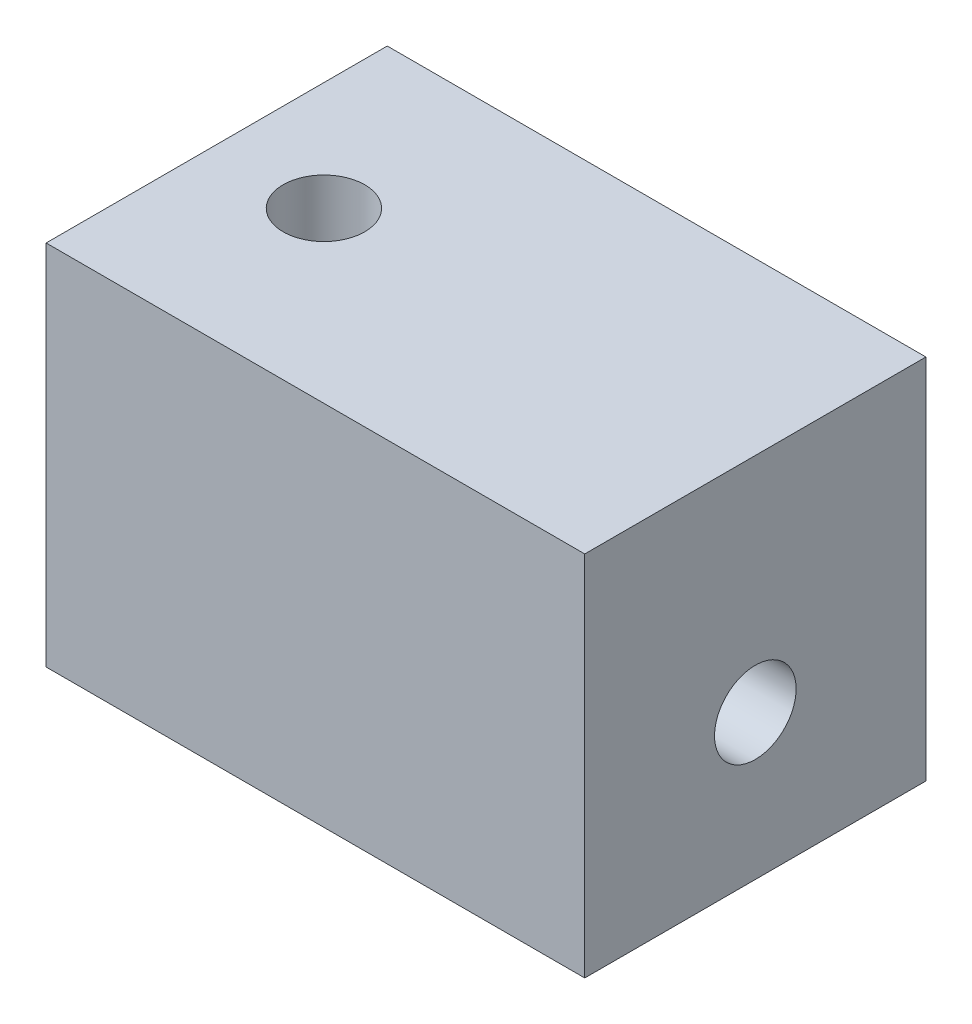
ISO-10303-21;
HEADER;
FILE_DESCRIPTION(('STEP AP214'),'2;1');
FILE_NAME('part.step','',(''),(''),'','','');
FILE_SCHEMA(('AUTOMOTIVE_DESIGN { 1 0 10303 214 1 1 1 1 }'));
ENDSEC;
DATA;
#1=APPLICATION_CONTEXT('core data for automotive mechanical design processes');
#2=APPLICATION_PROTOCOL_DEFINITION('international standard','automotive_design',2000,#1);
#3=PRODUCT_CONTEXT('',#1,'mechanical');
#4=PRODUCT('Part','Part','',(#3));
#5=PRODUCT_RELATED_PRODUCT_CATEGORY('part','',(#4));
#6=PRODUCT_DEFINITION_FORMATION('','',#4);
#7=PRODUCT_DEFINITION_CONTEXT('part definition',#1,'design');
#8=PRODUCT_DEFINITION('design','',#6,#7);
#9=PRODUCT_DEFINITION_SHAPE('','',#8);
#10=(LENGTH_UNIT() NAMED_UNIT(*) SI_UNIT(.MILLI.,.METRE.));
#11=(NAMED_UNIT(*) PLANE_ANGLE_UNIT() SI_UNIT($,.RADIAN.));
#12=(NAMED_UNIT(*) SI_UNIT($,.STERADIAN.) SOLID_ANGLE_UNIT());
#13=UNCERTAINTY_MEASURE_WITH_UNIT(LENGTH_MEASURE(1.E-05),#10,'distance_accuracy_value','');
#14=(GEOMETRIC_REPRESENTATION_CONTEXT(3) GLOBAL_UNCERTAINTY_ASSIGNED_CONTEXT((#13)) GLOBAL_UNIT_ASSIGNED_CONTEXT((#10,
#11,#12)) REPRESENTATION_CONTEXT('',''));
#15=CARTESIAN_POINT('',(0.,0.,0.));
#16=DIRECTION('',(0.,0.,1.));
#17=DIRECTION('',(1.,0.,0.));
#18=AXIS2_PLACEMENT_3D('',#15,#16,#17);
#19=CARTESIAN_POINT('',(0.,0.,12.9));
#20=DIRECTION('',(0.,0.,-1.));
#21=DIRECTION('',(-1.,0.,0.));
#22=AXIS2_PLACEMENT_3D('',#19,#20,#21);
#23=PLANE('',#22);
#24=DIRECTION('',(0.,-1.,0.));
#25=VECTOR('',#24,1.);
#26=CARTESIAN_POINT('',(-12.7,-12.7,12.9));
#27=LINE('',#26,#25);
#28=CARTESIAN_POINT('',(-12.7,-12.7,12.9));
#29=VERTEX_POINT('',#28);
#30=CARTESIAN_POINT('',(-12.7,-16.5,12.9));
#31=VERTEX_POINT('',#30);
#32=EDGE_CURVE('E241',#29,#31,#27,.T.);
#33=ORIENTED_EDGE('',*,*,#32,.F.);
#34=DIRECTION('',(1.,0.,0.));
#35=VECTOR('',#34,1.);
#36=CARTESIAN_POINT('',(-30.,-12.7,12.9));
#37=LINE('',#36,#35);
#38=CARTESIAN_POINT('',(-27.,-12.7,12.9));
#39=VERTEX_POINT('',#38);
#40=EDGE_CURVE('E56',#39,#29,#37,.T.);
#41=ORIENTED_EDGE('',*,*,#40,.F.);
#42=DIRECTION('',(0.,-1.,0.));
#43=VECTOR('',#42,1.);
#44=CARTESIAN_POINT('',(-27.,0.,12.9));
#45=LINE('',#44,#43);
#46=CARTESIAN_POINT('',(-27.,0.,12.9));
#47=VERTEX_POINT('',#46);
#48=EDGE_CURVE('E278',#47,#39,#45,.T.);
#49=ORIENTED_EDGE('',*,*,#48,.F.);
#50=DIRECTION('',(1.,0.,0.));
#51=VECTOR('',#50,1.);
#52=CARTESIAN_POINT('',(0.,0.,12.9));
#53=LINE('',#52,#51);
#54=CARTESIAN_POINT('',(0.,0.,12.9));
#55=VERTEX_POINT('',#54);
#56=EDGE_CURVE('E313',#47,#55,#53,.T.);
#57=ORIENTED_EDGE('',*,*,#56,.T.);
#58=DIRECTION('',(0.,-1.,0.));
#59=VECTOR('',#58,1.);
#60=CARTESIAN_POINT('',(0.,0.,12.9));
#61=LINE('',#60,#59);
#62=CARTESIAN_POINT('',(0.,-16.5,12.9));
#63=VERTEX_POINT('',#62);
#64=EDGE_CURVE('E310',#55,#63,#61,.T.);
#65=ORIENTED_EDGE('',*,*,#64,.T.);
#66=DIRECTION('',(1.,0.,0.));
#67=VECTOR('',#66,1.);
#68=CARTESIAN_POINT('',(0.,-16.5,12.9));
#69=LINE('',#68,#67);
#70=EDGE_CURVE('E63',#31,#63,#69,.T.);
#71=ORIENTED_EDGE('',*,*,#70,.F.);
#72=EDGE_LOOP('',(#33,#41,#49,#57,#65,#71));
#73=FACE_BOUND('',#72,.T.);
#74=ADVANCED_FACE('F40',(#73),#23,.T.);
#75=CARTESIAN_POINT('',(-14.,-16.5,16.9));
#76=DIRECTION('',(0.,1.,0.));
#77=DIRECTION('',(-1.,0.,0.));
#78=AXIS2_PLACEMENT_3D('',#75,#76,#77);
#79=PLANE('',#78);
#80=DIRECTION('',(0.,0.,-1.));
#81=VECTOR('',#80,1.);
#82=CARTESIAN_POINT('',(-12.7,-16.5,12.9));
#83=LINE('',#82,#81);
#84=CARTESIAN_POINT('',(-12.7,-16.5,-4.));
#85=VERTEX_POINT('',#84);
#86=EDGE_CURVE('E245',#31,#85,#83,.T.);
#87=ORIENTED_EDGE('',*,*,#86,.F.);
#88=ORIENTED_EDGE('',*,*,#70,.T.);
#89=DIRECTION('',(0.,0.,1.));
#90=VECTOR('',#89,1.);
#91=CARTESIAN_POINT('',(0.,-16.5,12.9));
#92=LINE('',#91,#90);
#93=CARTESIAN_POINT('',(0.,-16.5,-4.));
#94=VERTEX_POINT('',#93);
#95=EDGE_CURVE('E161',#94,#63,#92,.T.);
#96=ORIENTED_EDGE('',*,*,#95,.F.);
#97=DIRECTION('',(-1.,0.,0.));
#98=VECTOR('',#97,1.);
#99=CARTESIAN_POINT('',(0.,-16.5,-4.));
#100=LINE('',#99,#98);
#101=CARTESIAN_POINT('',(6.,-16.5,-4.));
#102=VERTEX_POINT('',#101);
#103=EDGE_CURVE('E157',#102,#94,#100,.T.);
#104=ORIENTED_EDGE('',*,*,#103,.F.);
#105=DIRECTION('',(0.,0.,1.));
#106=VECTOR('',#105,1.);
#107=CARTESIAN_POINT('',(6.,-16.5,16.9));
#108=LINE('',#107,#106);
#109=CARTESIAN_POINT('',(6.,-16.5,16.9));
#110=VERTEX_POINT('',#109);
#111=EDGE_CURVE('E143',#102,#110,#108,.T.);
#112=ORIENTED_EDGE('',*,*,#111,.T.);
#113=DIRECTION('',(1.,0.,0.));
#114=VECTOR('',#113,1.);
#115=CARTESIAN_POINT('',(-14.,-16.5,16.9));
#116=LINE('',#115,#114);
#117=CARTESIAN_POINT('',(-27.,-16.5,16.9));
#118=VERTEX_POINT('',#117);
#119=EDGE_CURVE('E153',#118,#110,#116,.T.);
#120=ORIENTED_EDGE('',*,*,#119,.F.);
#121=DIRECTION('',(0.,0.,1.));
#122=VECTOR('',#121,1.);
#123=CARTESIAN_POINT('',(-27.,-16.5,16.9));
#124=LINE('',#123,#122);
#125=CARTESIAN_POINT('',(-27.,-16.5,-4.));
#126=VERTEX_POINT('',#125);
#127=EDGE_CURVE('E252',#126,#118,#124,.T.);
#128=ORIENTED_EDGE('',*,*,#127,.F.);
#129=DIRECTION('',(1.,0.,0.));
#130=VECTOR('',#129,1.);
#131=CARTESIAN_POINT('',(0.,-16.5,-4.));
#132=LINE('',#131,#130);
#133=EDGE_CURVE('E189',#126,#85,#132,.T.);
#134=ORIENTED_EDGE('',*,*,#133,.T.);
#135=EDGE_LOOP('',(#87,#88,#96,#104,#112,#120,#128,#134));
#136=FACE_BOUND('',#135,.T.);
#137=CARTESIAN_POINT('',(-20.33,-16.5,6.45));
#138=DIRECTION('',(0.,1.,0.));
#139=DIRECTION('',(-1.,0.,0.));
#140=AXIS2_PLACEMENT_3D('',#137,#138,#139);
#141=CIRCLE('',#140,2.5);
#142=CARTESIAN_POINT('',(-22.83,-16.5,6.45));
#143=VERTEX_POINT('',#142);
#144=EDGE_CURVE('E154',#143,#143,#141,.F.);
#145=ORIENTED_EDGE('',*,*,#144,.F.);
#146=EDGE_LOOP('',(#145));
#147=FACE_BOUND('',#146,.T.);
#148=ADVANCED_FACE('F158',(#136,#147),#79,.F.);
#149=CARTESIAN_POINT('',(0.,0.,12.9));
#150=DIRECTION('',(1.,0.,0.));
#151=DIRECTION('',(0.,1.,0.));
#152=AXIS2_PLACEMENT_3D('',#149,#150,#151);
#153=PLANE('',#152);
#154=CARTESIAN_POINT('',(0.,-7.63,6.45));
#155=DIRECTION('',(-1.,0.,0.));
#156=DIRECTION('',(0.,-1.,0.));
#157=AXIS2_PLACEMENT_3D('',#154,#155,#156);
#158=CIRCLE('',#157,2.5);
#159=CARTESIAN_POINT('',(0.,-10.13,6.45));
#160=VERTEX_POINT('',#159);
#161=EDGE_CURVE('E293',#160,#160,#158,.T.);
#162=ORIENTED_EDGE('',*,*,#161,.F.);
#163=EDGE_LOOP('',(#162));
#164=FACE_BOUND('',#163,.T.);
#165=DIRECTION('',(0.,-1.,0.));
#166=VECTOR('',#165,1.);
#167=CARTESIAN_POINT('',(0.,0.,0.));
#168=LINE('',#167,#166);
#169=CARTESIAN_POINT('',(0.,0.,0.));
#170=VERTEX_POINT('',#169);
#171=CARTESIAN_POINT('',(0.,-3.5,0.));
#172=VERTEX_POINT('',#171);
#173=EDGE_CURVE('E306',#170,#172,#168,.T.);
#174=ORIENTED_EDGE('',*,*,#173,.T.);
#175=DIRECTION('',(0.,0.,1.));
#176=VECTOR('',#175,1.);
#177=CARTESIAN_POINT('',(0.,-3.5,-4.));
#178=LINE('',#177,#176);
#179=CARTESIAN_POINT('',(0.,-3.5,-4.));
#180=VERTEX_POINT('',#179);
#181=EDGE_CURVE('E231',#180,#172,#178,.T.);
#182=ORIENTED_EDGE('',*,*,#181,.F.);
#183=DIRECTION('',(0.,1.,0.));
#184=VECTOR('',#183,1.);
#185=CARTESIAN_POINT('',(0.,0.,-4.));
#186=LINE('',#185,#184);
#187=EDGE_CURVE('E165',#94,#180,#186,.T.);
#188=ORIENTED_EDGE('',*,*,#187,.F.);
#189=ORIENTED_EDGE('',*,*,#95,.T.);
#190=ORIENTED_EDGE('',*,*,#64,.F.);
#191=DIRECTION('',(0.,0.,-1.));
#192=VECTOR('',#191,1.);
#193=CARTESIAN_POINT('',(0.,0.,12.9));
#194=LINE('',#193,#192);
#195=EDGE_CURVE('E49',#55,#170,#194,.T.);
#196=ORIENTED_EDGE('',*,*,#195,.T.);
#197=EDGE_LOOP('',(#174,#182,#188,#189,#190,#196));
#198=FACE_BOUND('',#197,.T.);
#199=ADVANCED_FACE('F42',(#164,#198),#153,.F.);
#200=CARTESIAN_POINT('',(6.,6.,12.9));
#201=DIRECTION('',(-1.,0.,0.));
#202=DIRECTION('',(0.,-1.,0.));
#203=AXIS2_PLACEMENT_3D('',#200,#201,#202);
#204=PLANE('',#203);
#205=CARTESIAN_POINT('',(6.,-7.63,6.45));
#206=DIRECTION('',(-1.,0.,0.));
#207=DIRECTION('',(0.,-1.,0.));
#208=AXIS2_PLACEMENT_3D('',#205,#206,#207);
#209=CIRCLE('',#208,2.5);
#210=CARTESIAN_POINT('',(6.,-10.13,6.45));
#211=VERTEX_POINT('',#210);
#212=EDGE_CURVE('E294',#211,#211,#209,.T.);
#213=ORIENTED_EDGE('',*,*,#212,.T.);
#214=EDGE_LOOP('',(#213));
#215=FACE_BOUND('',#214,.T.);
#216=DIRECTION('',(0.,1.,0.));
#217=VECTOR('',#216,1.);
#218=CARTESIAN_POINT('',(6.,6.,16.9));
#219=LINE('',#218,#217);
#220=CARTESIAN_POINT('',(6.,6.,16.9));
#221=VERTEX_POINT('',#220);
#222=EDGE_CURVE('E149',#110,#221,#219,.T.);
#223=ORIENTED_EDGE('',*,*,#222,.F.);
#224=ORIENTED_EDGE('',*,*,#111,.F.);
#225=DIRECTION('',(0.,-1.,0.));
#226=VECTOR('',#225,1.);
#227=CARTESIAN_POINT('',(6.,0.,-4.));
#228=LINE('',#227,#226);
#229=CARTESIAN_POINT('',(6.,6.,-4.));
#230=VERTEX_POINT('',#229);
#231=EDGE_CURVE('E148',#230,#102,#228,.T.);
#232=ORIENTED_EDGE('',*,*,#231,.F.);
#233=DIRECTION('',(0.,0.,-1.));
#234=VECTOR('',#233,1.);
#235=CARTESIAN_POINT('',(6.,6.,12.9));
#236=LINE('',#235,#234);
#237=EDGE_CURVE('E11',#221,#230,#236,.T.);
#238=ORIENTED_EDGE('',*,*,#237,.F.);
#239=EDGE_LOOP('',(#223,#224,#232,#238));
#240=FACE_BOUND('',#239,.T.);
#241=ADVANCED_FACE('F145',(#215,#240),#204,.F.);
#242=CARTESIAN_POINT('',(-30.,6.,12.9));
#243=DIRECTION('',(0.,-1.,0.));
#244=DIRECTION('',(0.,0.,-1.));
#245=AXIS2_PLACEMENT_3D('',#242,#243,#244);
#246=PLANE('',#245);
#247=CARTESIAN_POINT('',(-20.33,6.,6.55));
#248=DIRECTION('',(0.,-1.,0.));
#249=DIRECTION('',(0.,0.,-1.));
#250=AXIS2_PLACEMENT_3D('',#247,#248,#249);
#251=CIRCLE('',#250,2.5);
#252=CARTESIAN_POINT('',(-20.33,6.,4.05));
#253=VERTEX_POINT('',#252);
#254=EDGE_CURVE('E302',#253,#253,#251,.T.);
#255=ORIENTED_EDGE('',*,*,#254,.T.);
#256=EDGE_LOOP('',(#255));
#257=FACE_BOUND('',#256,.T.);
#258=ORIENTED_EDGE('',*,*,#237,.T.);
#259=DIRECTION('',(1.,0.,0.));
#260=VECTOR('',#259,1.);
#261=CARTESIAN_POINT('',(0.,6.,-4.));
#262=LINE('',#261,#260);
#263=CARTESIAN_POINT('',(-27.,6.,-4.));
#264=VERTEX_POINT('',#263);
#265=EDGE_CURVE('E171',#264,#230,#262,.T.);
#266=ORIENTED_EDGE('',*,*,#265,.F.);
#267=DIRECTION('',(0.,0.,1.));
#268=VECTOR('',#267,1.);
#269=CARTESIAN_POINT('',(-27.,5.99999999999999,-4.));
#270=LINE('',#269,#268);
#271=CARTESIAN_POINT('',(-27.,5.99999999999999,16.9));
#272=VERTEX_POINT('',#271);
#273=EDGE_CURVE('E265',#264,#272,#270,.T.);
#274=ORIENTED_EDGE('',*,*,#273,.T.);
#275=DIRECTION('',(-1.,0.,0.));
#276=VECTOR('',#275,1.);
#277=CARTESIAN_POINT('',(6.,6.,16.9));
#278=LINE('',#277,#276);
#279=EDGE_CURVE('E289',#221,#272,#278,.T.);
#280=ORIENTED_EDGE('',*,*,#279,.F.);
#281=EDGE_LOOP('',(#258,#266,#274,#280));
#282=FACE_BOUND('',#281,.T.);
#283=ADVANCED_FACE('F349',(#257,#282),#246,.F.);
#284=CARTESIAN_POINT('',(0.,0.,12.9));
#285=DIRECTION('',(0.,1.,0.));
#286=DIRECTION('',(0.,0.,1.));
#287=AXIS2_PLACEMENT_3D('',#284,#285,#286);
#288=PLANE('',#287);
#289=CARTESIAN_POINT('',(-20.33,0.,6.55));
#290=DIRECTION('',(0.,-1.,0.));
#291=DIRECTION('',(0.,0.,-1.));
#292=AXIS2_PLACEMENT_3D('',#289,#290,#291);
#293=CIRCLE('',#292,2.5);
#294=CARTESIAN_POINT('',(-20.33,0.,4.05));
#295=VERTEX_POINT('',#294);
#296=EDGE_CURVE('E298',#295,#295,#293,.T.);
#297=ORIENTED_EDGE('',*,*,#296,.F.);
#298=EDGE_LOOP('',(#297));
#299=FACE_BOUND('',#298,.T.);
#300=ORIENTED_EDGE('',*,*,#56,.F.);
#301=DIRECTION('',(0.,0.,-1.));
#302=VECTOR('',#301,1.);
#303=CARTESIAN_POINT('',(-27.,0.,12.9));
#304=LINE('',#303,#302);
#305=CARTESIAN_POINT('',(-27.,0.,-4.));
#306=VERTEX_POINT('',#305);
#307=EDGE_CURVE('E275',#47,#306,#304,.T.);
#308=ORIENTED_EDGE('',*,*,#307,.T.);
#309=DIRECTION('',(-1.,0.,0.));
#310=VECTOR('',#309,1.);
#311=CARTESIAN_POINT('',(0.,0.,-4.));
#312=LINE('',#311,#310);
#313=CARTESIAN_POINT('',(-16.2,0.,-4.));
#314=VERTEX_POINT('',#313);
#315=EDGE_CURVE('E205',#314,#306,#312,.T.);
#316=ORIENTED_EDGE('',*,*,#315,.F.);
#317=DIRECTION('',(0.,0.,1.));
#318=VECTOR('',#317,1.);
#319=CARTESIAN_POINT('',(-16.2,0.,-4.));
#320=LINE('',#319,#318);
#321=CARTESIAN_POINT('',(-16.2,0.,0.));
#322=VERTEX_POINT('',#321);
#323=EDGE_CURVE('E214',#314,#322,#320,.T.);
#324=ORIENTED_EDGE('',*,*,#323,.T.);
#325=DIRECTION('',(-1.,0.,0.));
#326=VECTOR('',#325,1.);
#327=CARTESIAN_POINT('',(0.,0.,0.));
#328=LINE('',#327,#326);
#329=EDGE_CURVE('E238',#170,#322,#328,.T.);
#330=ORIENTED_EDGE('',*,*,#329,.F.);
#331=ORIENTED_EDGE('',*,*,#195,.F.);
#332=EDGE_LOOP('',(#300,#308,#316,#324,#330,#331));
#333=FACE_BOUND('',#332,.T.);
#334=ADVANCED_FACE('F327',(#299,#333),#288,.F.);
#335=CARTESIAN_POINT('',(-20.33,6.,6.55));
#336=DIRECTION('',(0.,-1.,0.));
#337=DIRECTION('',(0.,0.,-1.));
#338=AXIS2_PLACEMENT_3D('',#335,#336,#337);
#339=CYLINDRICAL_SURFACE('',#338,2.5);
#340=ORIENTED_EDGE('',*,*,#254,.F.);
#341=EDGE_LOOP('',(#340));
#342=FACE_BOUND('',#341,.T.);
#343=ORIENTED_EDGE('',*,*,#296,.T.);
#344=EDGE_LOOP('',(#343));
#345=FACE_BOUND('',#344,.T.);
#346=ADVANCED_FACE('F379',(#342,#345),#339,.F.);
#347=CARTESIAN_POINT('',(6.,-7.63,6.45));
#348=DIRECTION('',(-1.,0.,0.));
#349=DIRECTION('',(0.,-1.,0.));
#350=AXIS2_PLACEMENT_3D('',#347,#348,#349);
#351=CYLINDRICAL_SURFACE('',#350,2.5);
#352=ORIENTED_EDGE('',*,*,#212,.F.);
#353=EDGE_LOOP('',(#352));
#354=FACE_BOUND('',#353,.T.);
#355=ORIENTED_EDGE('',*,*,#161,.T.);
#356=EDGE_LOOP('',(#355));
#357=FACE_BOUND('',#356,.T.);
#358=ADVANCED_FACE('F376',(#354,#357),#351,.F.);
#359=CARTESIAN_POINT('',(0.,0.,16.9));
#360=DIRECTION('',(0.,0.,-1.));
#361=DIRECTION('',(-1.,0.,0.));
#362=AXIS2_PLACEMENT_3D('',#359,#360,#361);
#363=PLANE('',#362);
#364=DIRECTION('',(0.,-1.,0.));
#365=VECTOR('',#364,1.);
#366=CARTESIAN_POINT('',(-27.,5.99999999999999,16.9));
#367=LINE('',#366,#365);
#368=EDGE_CURVE('E268',#272,#118,#367,.T.);
#369=ORIENTED_EDGE('',*,*,#368,.T.);
#370=ORIENTED_EDGE('',*,*,#119,.T.);
#371=ORIENTED_EDGE('',*,*,#222,.T.);
#372=ORIENTED_EDGE('',*,*,#279,.T.);
#373=EDGE_LOOP('',(#369,#370,#371,#372));
#374=FACE_BOUND('',#373,.T.);
#375=ADVANCED_FACE('F346',(#374),#363,.F.);
#376=CARTESIAN_POINT('',(-30.,-12.7,0.));
#377=DIRECTION('',(0.,-1.,0.));
#378=DIRECTION('',(1.,0.,0.));
#379=AXIS2_PLACEMENT_3D('',#376,#377,#378);
#380=PLANE('',#379);
#381=CARTESIAN_POINT('',(-20.33,-12.7,6.45));
#382=DIRECTION('',(0.,1.,0.));
#383=DIRECTION('',(-1.,0.,0.));
#384=AXIS2_PLACEMENT_3D('',#381,#382,#383);
#385=CIRCLE('',#384,2.5);
#386=CARTESIAN_POINT('',(-22.83,-12.7,6.45));
#387=VERTEX_POINT('',#386);
#388=EDGE_CURVE('E281',#387,#387,#385,.T.);
#389=ORIENTED_EDGE('',*,*,#388,.F.);
#390=EDGE_LOOP('',(#389));
#391=FACE_BOUND('',#390,.T.);
#392=ORIENTED_EDGE('',*,*,#40,.T.);
#393=DIRECTION('',(0.,0.,1.));
#394=VECTOR('',#393,1.);
#395=CARTESIAN_POINT('',(-12.7,-12.7,12.9));
#396=LINE('',#395,#394);
#397=CARTESIAN_POINT('',(-12.7,-12.7,0.));
#398=VERTEX_POINT('',#397);
#399=EDGE_CURVE('E248',#398,#29,#396,.T.);
#400=ORIENTED_EDGE('',*,*,#399,.F.);
#401=DIRECTION('',(1.,0.,0.));
#402=VECTOR('',#401,1.);
#403=CARTESIAN_POINT('',(-30.,-12.7,0.));
#404=LINE('',#403,#402);
#405=CARTESIAN_POINT('',(-16.2,-12.7,0.));
#406=VERTEX_POINT('',#405);
#407=EDGE_CURVE('E234',#406,#398,#404,.T.);
#408=ORIENTED_EDGE('',*,*,#407,.F.);
#409=DIRECTION('',(0.,0.,1.));
#410=VECTOR('',#409,1.);
#411=CARTESIAN_POINT('',(-16.2,-12.7,-4.));
#412=LINE('',#411,#410);
#413=CARTESIAN_POINT('',(-16.2,-12.7,-4.));
#414=VERTEX_POINT('',#413);
#415=EDGE_CURVE('E224',#414,#406,#412,.T.);
#416=ORIENTED_EDGE('',*,*,#415,.F.);
#417=DIRECTION('',(-1.,0.,0.));
#418=VECTOR('',#417,1.);
#419=CARTESIAN_POINT('',(0.,-12.7,-4.));
#420=LINE('',#419,#418);
#421=CARTESIAN_POINT('',(-27.,-12.7,-4.));
#422=VERTEX_POINT('',#421);
#423=EDGE_CURVE('E197',#414,#422,#420,.T.);
#424=ORIENTED_EDGE('',*,*,#423,.T.);
#425=DIRECTION('',(0.,0.,1.));
#426=VECTOR('',#425,1.);
#427=CARTESIAN_POINT('',(-27.,-12.7,0.));
#428=LINE('',#427,#426);
#429=EDGE_CURVE('E272',#422,#39,#428,.T.);
#430=ORIENTED_EDGE('',*,*,#429,.T.);
#431=EDGE_LOOP('',(#392,#400,#408,#416,#424,#430));
#432=FACE_BOUND('',#431,.T.);
#433=ADVANCED_FACE('F355',(#391,#432),#380,.F.);
#434=CARTESIAN_POINT('',(-20.33,-18.,6.45));
#435=DIRECTION('',(0.,1.,0.));
#436=DIRECTION('',(-1.,0.,0.));
#437=AXIS2_PLACEMENT_3D('',#434,#435,#436);
#438=CYLINDRICAL_SURFACE('',#437,2.5);
#439=ORIENTED_EDGE('',*,*,#144,.T.);
#440=EDGE_LOOP('',(#439));
#441=FACE_BOUND('',#440,.T.);
#442=ORIENTED_EDGE('',*,*,#388,.T.);
#443=EDGE_LOOP('',(#442));
#444=FACE_BOUND('',#443,.T.);
#445=ADVANCED_FACE('F417',(#441,#444),#438,.F.);
#446=CARTESIAN_POINT('',(-27.,5.99999999999999,-4.));
#447=DIRECTION('',(1.,0.,0.));
#448=DIRECTION('',(0.,0.,-1.));
#449=AXIS2_PLACEMENT_3D('',#446,#447,#448);
#450=PLANE('',#449);
#451=ORIENTED_EDGE('',*,*,#429,.F.);
#452=DIRECTION('',(0.,-1.,0.));
#453=VECTOR('',#452,1.);
#454=CARTESIAN_POINT('',(-27.,0.,-4.));
#455=LINE('',#454,#453);
#456=EDGE_CURVE('E193',#422,#126,#455,.T.);
#457=ORIENTED_EDGE('',*,*,#456,.T.);
#458=ORIENTED_EDGE('',*,*,#127,.T.);
#459=ORIENTED_EDGE('',*,*,#368,.F.);
#460=ORIENTED_EDGE('',*,*,#273,.F.);
#461=DIRECTION('',(0.,1.,0.));
#462=VECTOR('',#461,1.);
#463=CARTESIAN_POINT('',(-27.,0.,-4.));
#464=LINE('',#463,#462);
#465=EDGE_CURVE('E209',#306,#264,#464,.T.);
#466=ORIENTED_EDGE('',*,*,#465,.F.);
#467=ORIENTED_EDGE('',*,*,#307,.F.);
#468=ORIENTED_EDGE('',*,*,#48,.T.);
#469=EDGE_LOOP('',(#451,#457,#458,#459,#460,#466,#467,#468));
#470=FACE_BOUND('',#469,.T.);
#471=ADVANCED_FACE('F344',(#470),#450,.F.);
#472=CARTESIAN_POINT('',(-12.7,0.,0.));
#473=DIRECTION('',(1.,0.,0.));
#474=DIRECTION('',(0.,1.,0.));
#475=AXIS2_PLACEMENT_3D('',#472,#473,#474);
#476=PLANE('',#475);
#477=ORIENTED_EDGE('',*,*,#32,.T.);
#478=ORIENTED_EDGE('',*,*,#86,.T.);
#479=DIRECTION('',(0.,1.,0.));
#480=VECTOR('',#479,1.);
#481=CARTESIAN_POINT('',(-12.7,0.,-4.));
#482=LINE('',#481,#480);
#483=CARTESIAN_POINT('',(-12.7,-3.5,-4.));
#484=VERTEX_POINT('',#483);
#485=EDGE_CURVE('E185',#85,#484,#482,.T.);
#486=ORIENTED_EDGE('',*,*,#485,.T.);
#487=DIRECTION('',(0.,0.,1.));
#488=VECTOR('',#487,1.);
#489=CARTESIAN_POINT('',(-12.7,-3.5,-4.));
#490=LINE('',#489,#488);
#491=CARTESIAN_POINT('',(-12.7,-3.5,0.));
#492=VERTEX_POINT('',#491);
#493=EDGE_CURVE('E227',#484,#492,#490,.T.);
#494=ORIENTED_EDGE('',*,*,#493,.T.);
#495=DIRECTION('',(0.,1.,0.));
#496=VECTOR('',#495,1.);
#497=CARTESIAN_POINT('',(-12.7,0.,0.));
#498=LINE('',#497,#496);
#499=EDGE_CURVE('E177',#398,#492,#498,.T.);
#500=ORIENTED_EDGE('',*,*,#499,.F.);
#501=ORIENTED_EDGE('',*,*,#399,.T.);
#502=EDGE_LOOP('',(#477,#478,#486,#494,#500,#501));
#503=FACE_BOUND('',#502,.T.);
#504=ADVANCED_FACE('F354',(#503),#476,.T.);
#505=CARTESIAN_POINT('',(0.,0.,0.));
#506=DIRECTION('',(0.,0.,-1.));
#507=DIRECTION('',(-1.,0.,0.));
#508=AXIS2_PLACEMENT_3D('',#505,#506,#507);
#509=PLANE('',#508);
#510=DIRECTION('',(-1.,0.,0.));
#511=VECTOR('',#510,1.);
#512=CARTESIAN_POINT('',(0.,-3.5,0.));
#513=LINE('',#512,#511);
#514=EDGE_CURVE('E215',#172,#492,#513,.T.);
#515=ORIENTED_EDGE('',*,*,#514,.F.);
#516=ORIENTED_EDGE('',*,*,#173,.F.);
#517=ORIENTED_EDGE('',*,*,#329,.T.);
#518=DIRECTION('',(0.,-1.,0.));
#519=VECTOR('',#518,1.);
#520=CARTESIAN_POINT('',(-16.2,0.,0.));
#521=LINE('',#520,#519);
#522=EDGE_CURVE('E173',#322,#406,#521,.T.);
#523=ORIENTED_EDGE('',*,*,#522,.T.);
#524=ORIENTED_EDGE('',*,*,#407,.T.);
#525=ORIENTED_EDGE('',*,*,#499,.T.);
#526=EDGE_LOOP('',(#515,#516,#517,#523,#524,#525));
#527=FACE_BOUND('',#526,.T.);
#528=ADVANCED_FACE('F332',(#527),#509,.F.);
#529=CARTESIAN_POINT('',(0.,-3.5,-4.));
#530=DIRECTION('',(0.,1.,0.));
#531=DIRECTION('',(-1.,0.,0.));
#532=AXIS2_PLACEMENT_3D('',#529,#530,#531);
#533=PLANE('',#532);
#534=ORIENTED_EDGE('',*,*,#514,.T.);
#535=ORIENTED_EDGE('',*,*,#493,.F.);
#536=DIRECTION('',(-1.,0.,0.));
#537=VECTOR('',#536,1.);
#538=CARTESIAN_POINT('',(0.,-3.5,-4.));
#539=LINE('',#538,#537);
#540=EDGE_CURVE('E182',#180,#484,#539,.T.);
#541=ORIENTED_EDGE('',*,*,#540,.F.);
#542=ORIENTED_EDGE('',*,*,#181,.T.);
#543=EDGE_LOOP('',(#534,#535,#541,#542));
#544=FACE_BOUND('',#543,.T.);
#545=ADVANCED_FACE('F336',(#544),#533,.F.);
#546=CARTESIAN_POINT('',(-16.2,0.,-4.));
#547=DIRECTION('',(-1.,0.,0.));
#548=DIRECTION('',(0.,0.,1.));
#549=AXIS2_PLACEMENT_3D('',#546,#547,#548);
#550=PLANE('',#549);
#551=ORIENTED_EDGE('',*,*,#522,.F.);
#552=ORIENTED_EDGE('',*,*,#323,.F.);
#553=DIRECTION('',(0.,-1.,0.));
#554=VECTOR('',#553,1.);
#555=CARTESIAN_POINT('',(-16.2,0.,-4.));
#556=LINE('',#555,#554);
#557=EDGE_CURVE('E201',#314,#414,#556,.T.);
#558=ORIENTED_EDGE('',*,*,#557,.T.);
#559=ORIENTED_EDGE('',*,*,#415,.T.);
#560=EDGE_LOOP('',(#551,#552,#558,#559));
#561=FACE_BOUND('',#560,.T.);
#562=ADVANCED_FACE('F357',(#561),#550,.T.);
#563=CARTESIAN_POINT('',(0.,0.,-4.));
#564=DIRECTION('',(0.,0.,-1.));
#565=DIRECTION('',(-1.,0.,0.));
#566=AXIS2_PLACEMENT_3D('',#563,#564,#565);
#567=PLANE('',#566);
#568=ORIENTED_EDGE('',*,*,#231,.T.);
#569=ORIENTED_EDGE('',*,*,#103,.T.);
#570=ORIENTED_EDGE('',*,*,#187,.T.);
#571=ORIENTED_EDGE('',*,*,#540,.T.);
#572=ORIENTED_EDGE('',*,*,#485,.F.);
#573=ORIENTED_EDGE('',*,*,#133,.F.);
#574=ORIENTED_EDGE('',*,*,#456,.F.);
#575=ORIENTED_EDGE('',*,*,#423,.F.);
#576=ORIENTED_EDGE('',*,*,#557,.F.);
#577=ORIENTED_EDGE('',*,*,#315,.T.);
#578=ORIENTED_EDGE('',*,*,#465,.T.);
#579=ORIENTED_EDGE('',*,*,#265,.T.);
#580=EDGE_LOOP('',(#568,#569,#570,#571,#572,#573,#574,#575,#576,#577,#578,#579));
#581=FACE_BOUND('',#580,.T.);
#582=ADVANCED_FACE('F168',(#581),#567,.T.);
#583=CLOSED_SHELL('',(#74,#148,#199,#241,#283,#334,#346,#358,#375,#433,#445,#471,#504,#528,#545,
#562,#582));
#584=MANIFOLD_SOLID_BREP('B2',#583);
#585=ADVANCED_BREP_SHAPE_REPRESENTATION('',(#18,#584),#14);
#586=SHAPE_DEFINITION_REPRESENTATION(#9,#585);
ENDSEC;
END-ISO-10303-21;
